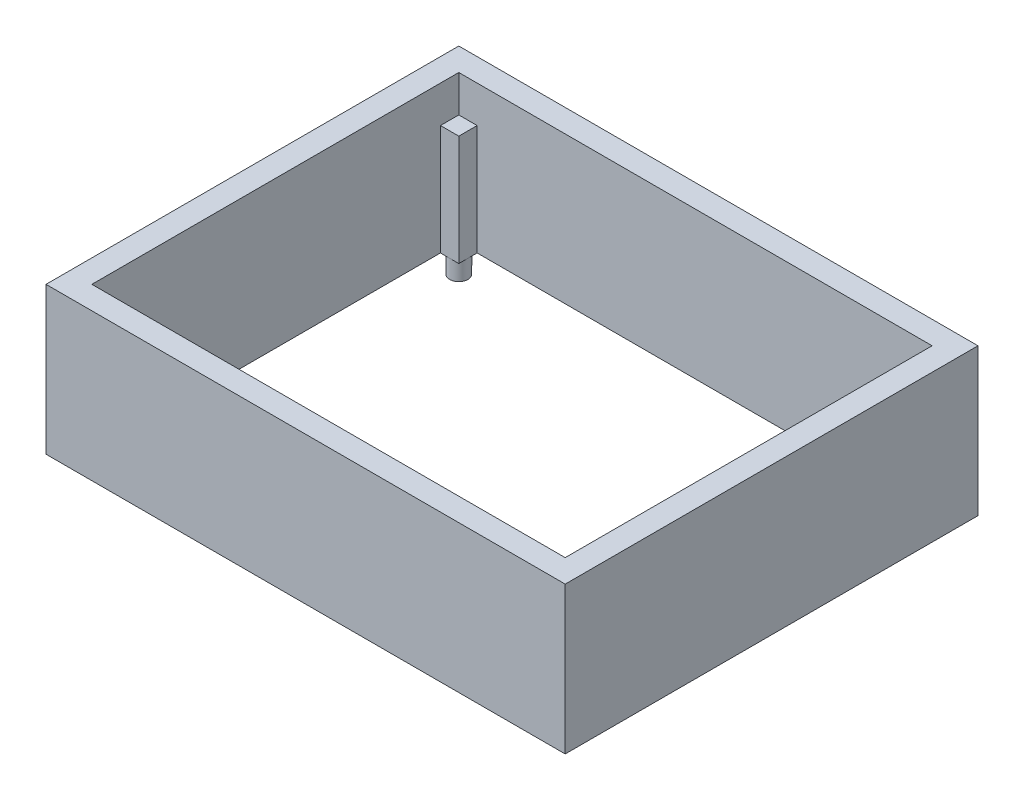
ISO-10303-21;
HEADER;
FILE_DESCRIPTION(('STEP AP214'),'2;1');
FILE_NAME('part.step','',(''),(''),'','','');
FILE_SCHEMA(('AUTOMOTIVE_DESIGN { 1 0 10303 214 1 1 1 1 }'));
ENDSEC;
DATA;
#1=APPLICATION_CONTEXT('core data for automotive mechanical design processes');
#2=APPLICATION_PROTOCOL_DEFINITION('international standard','automotive_design',2000,#1);
#3=PRODUCT_CONTEXT('',#1,'mechanical');
#4=PRODUCT('Part','Part','',(#3));
#5=PRODUCT_RELATED_PRODUCT_CATEGORY('part','',(#4));
#6=PRODUCT_DEFINITION_FORMATION('','',#4);
#7=PRODUCT_DEFINITION_CONTEXT('part definition',#1,'design');
#8=PRODUCT_DEFINITION('design','',#6,#7);
#9=PRODUCT_DEFINITION_SHAPE('','',#8);
#10=(LENGTH_UNIT() NAMED_UNIT(*) SI_UNIT(.MILLI.,.METRE.));
#11=(NAMED_UNIT(*) PLANE_ANGLE_UNIT() SI_UNIT($,.RADIAN.));
#12=(NAMED_UNIT(*) SI_UNIT($,.STERADIAN.) SOLID_ANGLE_UNIT());
#13=UNCERTAINTY_MEASURE_WITH_UNIT(LENGTH_MEASURE(1.E-05),#10,'distance_accuracy_value','');
#14=(GEOMETRIC_REPRESENTATION_CONTEXT(3) GLOBAL_UNCERTAINTY_ASSIGNED_CONTEXT((#13)) GLOBAL_UNIT_ASSIGNED_CONTEXT((#10,
#11,#12)) REPRESENTATION_CONTEXT('',''));
#15=CARTESIAN_POINT('',(0.,0.,0.));
#16=DIRECTION('',(0.,0.,1.));
#17=DIRECTION('',(1.,0.,0.));
#18=AXIS2_PLACEMENT_3D('',#15,#16,#17);
#19=CARTESIAN_POINT('',(0.,0.,0.));
#20=DIRECTION('',(0.,-1.,0.));
#21=DIRECTION('',(0.,0.,-1.));
#22=AXIS2_PLACEMENT_3D('',#19,#20,#21);
#23=PLANE('',#22);
#24=DIRECTION('',(-1.,0.,0.));
#25=VECTOR('',#24,1.);
#26=CARTESIAN_POINT('',(12.5,0.,-202.5));
#27=LINE('',#26,#25);
#28=CARTESIAN_POINT('',(22.5,0.,-202.5));
#29=VERTEX_POINT('',#28);
#30=CARTESIAN_POINT('',(17.5,0.,-202.5));
#31=VERTEX_POINT('',#30);
#32=EDGE_CURVE('E205',#29,#31,#27,.T.);
#33=ORIENTED_EDGE('',*,*,#32,.T.);
#34=CARTESIAN_POINT('',(17.5,0.,-207.5));
#35=DIRECTION('',(0.,-1.,0.));
#36=DIRECTION('',(0.,0.,-1.));
#37=AXIS2_PLACEMENT_3D('',#34,#35,#36);
#38=CIRCLE('',#37,5.);
#39=CARTESIAN_POINT('',(22.5,0.,-207.5));
#40=VERTEX_POINT('',#39);
#41=EDGE_CURVE('E49',#40,#31,#38,.T.);
#42=ORIENTED_EDGE('',*,*,#41,.F.);
#43=DIRECTION('',(0.,0.,1.));
#44=VECTOR('',#43,1.);
#45=CARTESIAN_POINT('',(22.5,0.,-212.5));
#46=LINE('',#45,#44);
#47=EDGE_CURVE('E202',#40,#29,#46,.T.);
#48=ORIENTED_EDGE('',*,*,#47,.T.);
#49=EDGE_LOOP('',(#33,#42,#48));
#50=FACE_BOUND('',#49,.T.);
#51=ADVANCED_FACE('F32',(#50),#23,.T.);
#52=DIRECTION('',(0.,0.,-1.));
#53=VECTOR('',#52,1.);
#54=CARTESIAN_POINT('',(260.5,0.,-212.5));
#55=LINE('',#54,#53);
#56=CARTESIAN_POINT('',(260.5,0.,-202.5));
#57=VERTEX_POINT('',#56);
#58=CARTESIAN_POINT('',(260.5,0.,-207.5));
#59=VERTEX_POINT('',#58);
#60=EDGE_CURVE('E694',#57,#59,#55,.T.);
#61=ORIENTED_EDGE('',*,*,#60,.T.);
#62=CARTESIAN_POINT('',(265.5,0.,-207.5));
#63=DIRECTION('',(0.,-1.,0.));
#64=DIRECTION('',(0.,0.,-1.));
#65=AXIS2_PLACEMENT_3D('',#62,#63,#64);
#66=CIRCLE('',#65,4.99999999999999);
#67=CARTESIAN_POINT('',(265.5,0.,-202.5));
#68=VERTEX_POINT('',#67);
#69=EDGE_CURVE('E56',#68,#59,#66,.T.);
#70=ORIENTED_EDGE('',*,*,#69,.F.);
#71=DIRECTION('',(-1.,0.,0.));
#72=VECTOR('',#71,1.);
#73=CARTESIAN_POINT('',(270.5,0.,-202.5));
#74=LINE('',#73,#72);
#75=EDGE_CURVE('E684',#68,#57,#74,.T.);
#76=ORIENTED_EDGE('',*,*,#75,.T.);
#77=EDGE_LOOP('',(#61,#70,#76));
#78=FACE_BOUND('',#77,.T.);
#79=ADVANCED_FACE('F346',(#78),#23,.T.);
#80=DIRECTION('',(1.,0.,0.));
#81=VECTOR('',#80,1.);
#82=CARTESIAN_POINT('',(270.5,0.,-22.5));
#83=LINE('',#82,#81);
#84=CARTESIAN_POINT('',(260.5,0.,-22.5));
#85=VERTEX_POINT('',#84);
#86=CARTESIAN_POINT('',(265.5,0.,-22.5));
#87=VERTEX_POINT('',#86);
#88=EDGE_CURVE('E665',#85,#87,#83,.T.);
#89=ORIENTED_EDGE('',*,*,#88,.T.);
#90=CARTESIAN_POINT('',(265.5,0.,-17.5));
#91=DIRECTION('',(0.,-1.,0.));
#92=DIRECTION('',(0.,0.,-1.));
#93=AXIS2_PLACEMENT_3D('',#90,#91,#92);
#94=CIRCLE('',#93,4.99999999999999);
#95=CARTESIAN_POINT('',(260.5,0.,-17.5));
#96=VERTEX_POINT('',#95);
#97=EDGE_CURVE('E649',#96,#87,#94,.T.);
#98=ORIENTED_EDGE('',*,*,#97,.F.);
#99=DIRECTION('',(0.,0.,-1.));
#100=VECTOR('',#99,1.);
#101=CARTESIAN_POINT('',(260.5,0.,-12.5));
#102=LINE('',#101,#100);
#103=EDGE_CURVE('E658',#96,#85,#102,.T.);
#104=ORIENTED_EDGE('',*,*,#103,.T.);
#105=EDGE_LOOP('',(#89,#98,#104));
#106=FACE_BOUND('',#105,.T.);
#107=ADVANCED_FACE('F351',(#106),#23,.T.);
#108=CARTESIAN_POINT('',(17.5,0.,-17.5));
#109=DIRECTION('',(0.,-1.,0.));
#110=DIRECTION('',(0.,0.,-1.));
#111=AXIS2_PLACEMENT_3D('',#108,#109,#110);
#112=CIRCLE('',#111,5.);
#113=CARTESIAN_POINT('',(17.5,0.,-22.5));
#114=VERTEX_POINT('',#113);
#115=CARTESIAN_POINT('',(22.5,0.,-17.5));
#116=VERTEX_POINT('',#115);
#117=EDGE_CURVE('E43',#114,#116,#112,.T.);
#118=ORIENTED_EDGE('',*,*,#117,.F.);
#119=DIRECTION('',(1.,0.,0.));
#120=VECTOR('',#119,1.);
#121=CARTESIAN_POINT('',(12.5,0.,-22.5));
#122=LINE('',#121,#120);
#123=CARTESIAN_POINT('',(22.5,0.,-22.5));
#124=VERTEX_POINT('',#123);
#125=EDGE_CURVE('E230',#114,#124,#122,.T.);
#126=ORIENTED_EDGE('',*,*,#125,.T.);
#127=DIRECTION('',(0.,0.,1.));
#128=VECTOR('',#127,1.);
#129=CARTESIAN_POINT('',(22.5,0.,-12.5));
#130=LINE('',#129,#128);
#131=EDGE_CURVE('E238',#124,#116,#130,.T.);
#132=ORIENTED_EDGE('',*,*,#131,.T.);
#133=EDGE_LOOP('',(#118,#126,#132));
#134=FACE_BOUND('',#133,.T.);
#135=ADVANCED_FACE('F342',(#134),#23,.T.);
#136=CARTESIAN_POINT('',(0.,80.2,0.));
#137=DIRECTION('',(-1.,0.,0.));
#138=DIRECTION('',(0.,0.,1.));
#139=AXIS2_PLACEMENT_3D('',#136,#137,#138);
#140=PLANE('',#139);
#141=DIRECTION('',(0.,0.,-1.));
#142=VECTOR('',#141,1.);
#143=CARTESIAN_POINT('',(0.,0.,0.));
#144=LINE('',#143,#142);
#145=CARTESIAN_POINT('',(0.,0.,0.));
#146=VERTEX_POINT('',#145);
#147=CARTESIAN_POINT('',(0.,0.,-225.));
#148=VERTEX_POINT('',#147);
#149=EDGE_CURVE('E288',#146,#148,#144,.T.);
#150=ORIENTED_EDGE('',*,*,#149,.F.);
#151=DIRECTION('',(0.,-1.,0.));
#152=VECTOR('',#151,1.);
#153=CARTESIAN_POINT('',(0.,80.2,0.));
#154=LINE('',#153,#152);
#155=CARTESIAN_POINT('',(0.,80.2,0.));
#156=VERTEX_POINT('',#155);
#157=EDGE_CURVE('E41',#156,#146,#154,.T.);
#158=ORIENTED_EDGE('',*,*,#157,.F.);
#159=DIRECTION('',(0.,0.,-1.));
#160=VECTOR('',#159,1.);
#161=CARTESIAN_POINT('',(0.,80.2,0.));
#162=LINE('',#161,#160);
#163=CARTESIAN_POINT('',(0.,80.2,-225.));
#164=VERTEX_POINT('',#163);
#165=EDGE_CURVE('E289',#156,#164,#162,.T.);
#166=ORIENTED_EDGE('',*,*,#165,.T.);
#167=DIRECTION('',(0.,-1.,0.));
#168=VECTOR('',#167,1.);
#169=CARTESIAN_POINT('',(0.,80.2,-225.));
#170=LINE('',#169,#168);
#171=EDGE_CURVE('E36',#164,#148,#170,.T.);
#172=ORIENTED_EDGE('',*,*,#171,.T.);
#173=EDGE_LOOP('',(#150,#158,#166,#172));
#174=FACE_BOUND('',#173,.T.);
#175=ADVANCED_FACE('F34',(#174),#140,.T.);
#176=CARTESIAN_POINT('',(0.,80.2,0.));
#177=DIRECTION('',(0.,0.,-1.));
#178=DIRECTION('',(-1.,0.,0.));
#179=AXIS2_PLACEMENT_3D('',#176,#177,#178);
#180=PLANE('',#179);
#181=DIRECTION('',(1.,0.,0.));
#182=VECTOR('',#181,1.);
#183=CARTESIAN_POINT('',(0.,0.,0.));
#184=LINE('',#183,#182);
#185=CARTESIAN_POINT('',(283.,0.,0.));
#186=VERTEX_POINT('',#185);
#187=EDGE_CURVE('E293',#146,#186,#184,.T.);
#188=ORIENTED_EDGE('',*,*,#187,.T.);
#189=DIRECTION('',(0.,-1.,0.));
#190=VECTOR('',#189,1.);
#191=CARTESIAN_POINT('',(283.,80.2,0.));
#192=LINE('',#191,#190);
#193=CARTESIAN_POINT('',(283.,80.2,0.));
#194=VERTEX_POINT('',#193);
#195=EDGE_CURVE('E310',#194,#186,#192,.T.);
#196=ORIENTED_EDGE('',*,*,#195,.F.);
#197=DIRECTION('',(1.,0.,0.));
#198=VECTOR('',#197,1.);
#199=CARTESIAN_POINT('',(0.,80.2,0.));
#200=LINE('',#199,#198);
#201=EDGE_CURVE('E298',#156,#194,#200,.T.);
#202=ORIENTED_EDGE('',*,*,#201,.F.);
#203=ORIENTED_EDGE('',*,*,#157,.T.);
#204=EDGE_LOOP('',(#188,#196,#202,#203));
#205=FACE_BOUND('',#204,.T.);
#206=ADVANCED_FACE('F325',(#205),#180,.F.);
#207=CARTESIAN_POINT('',(283.,80.2,0.));
#208=DIRECTION('',(-1.,0.,0.));
#209=DIRECTION('',(0.,0.,1.));
#210=AXIS2_PLACEMENT_3D('',#207,#208,#209);
#211=PLANE('',#210);
#212=DIRECTION('',(0.,0.,-1.));
#213=VECTOR('',#212,1.);
#214=CARTESIAN_POINT('',(283.,0.,0.));
#215=LINE('',#214,#213);
#216=CARTESIAN_POINT('',(283.,0.,-225.));
#217=VERTEX_POINT('',#216);
#218=EDGE_CURVE('E305',#186,#217,#215,.T.);
#219=ORIENTED_EDGE('',*,*,#218,.T.);
#220=DIRECTION('',(0.,-1.,0.));
#221=VECTOR('',#220,1.);
#222=CARTESIAN_POINT('',(283.,80.2,-225.));
#223=LINE('',#222,#221);
#224=CARTESIAN_POINT('',(283.,80.2,-225.));
#225=VERTEX_POINT('',#224);
#226=EDGE_CURVE('E312',#225,#217,#223,.T.);
#227=ORIENTED_EDGE('',*,*,#226,.F.);
#228=DIRECTION('',(0.,0.,-1.));
#229=VECTOR('',#228,1.);
#230=CARTESIAN_POINT('',(283.,80.2,0.));
#231=LINE('',#230,#229);
#232=EDGE_CURVE('E296',#194,#225,#231,.T.);
#233=ORIENTED_EDGE('',*,*,#232,.F.);
#234=ORIENTED_EDGE('',*,*,#195,.T.);
#235=EDGE_LOOP('',(#219,#227,#233,#234));
#236=FACE_BOUND('',#235,.T.);
#237=ADVANCED_FACE('F329',(#236),#211,.F.);
#238=CARTESIAN_POINT('',(0.,80.2,-225.));
#239=DIRECTION('',(0.,0.,-1.));
#240=DIRECTION('',(-1.,0.,0.));
#241=AXIS2_PLACEMENT_3D('',#238,#239,#240);
#242=PLANE('',#241);
#243=DIRECTION('',(1.,0.,0.));
#244=VECTOR('',#243,1.);
#245=CARTESIAN_POINT('',(0.,0.,-225.));
#246=LINE('',#245,#244);
#247=EDGE_CURVE('E302',#148,#217,#246,.T.);
#248=ORIENTED_EDGE('',*,*,#247,.F.);
#249=ORIENTED_EDGE('',*,*,#171,.F.);
#250=DIRECTION('',(1.,0.,0.));
#251=VECTOR('',#250,1.);
#252=CARTESIAN_POINT('',(0.,80.2,-225.));
#253=LINE('',#252,#251);
#254=EDGE_CURVE('E292',#164,#225,#253,.T.);
#255=ORIENTED_EDGE('',*,*,#254,.T.);
#256=ORIENTED_EDGE('',*,*,#226,.T.);
#257=EDGE_LOOP('',(#248,#249,#255,#256));
#258=FACE_BOUND('',#257,.T.);
#259=ADVANCED_FACE('F320',(#258),#242,.T.);
#260=CARTESIAN_POINT('',(0.,80.2,0.));
#261=DIRECTION('',(0.,-1.,0.));
#262=DIRECTION('',(0.,0.,-1.));
#263=AXIS2_PLACEMENT_3D('',#260,#261,#262);
#264=PLANE('',#263);
#265=DIRECTION('',(1.,0.,0.));
#266=VECTOR('',#265,1.);
#267=CARTESIAN_POINT('',(12.5,80.2,-12.5));
#268=LINE('',#267,#266);
#269=CARTESIAN_POINT('',(12.5,80.2,-12.5));
#270=VERTEX_POINT('',#269);
#271=CARTESIAN_POINT('',(270.5,80.2,-12.5));
#272=VERTEX_POINT('',#271);
#273=EDGE_CURVE('E265',#270,#272,#268,.T.);
#274=ORIENTED_EDGE('',*,*,#273,.F.);
#275=DIRECTION('',(0.,0.,1.));
#276=VECTOR('',#275,1.);
#277=CARTESIAN_POINT('',(12.5,80.2,-212.5));
#278=LINE('',#277,#276);
#279=CARTESIAN_POINT('',(12.5,80.2,-212.5));
#280=VERTEX_POINT('',#279);
#281=EDGE_CURVE('E268',#280,#270,#278,.T.);
#282=ORIENTED_EDGE('',*,*,#281,.F.);
#283=DIRECTION('',(-1.,0.,0.));
#284=VECTOR('',#283,1.);
#285=CARTESIAN_POINT('',(270.5,80.2,-212.5));
#286=LINE('',#285,#284);
#287=CARTESIAN_POINT('',(270.5,80.2,-212.5));
#288=VERTEX_POINT('',#287);
#289=EDGE_CURVE('E255',#288,#280,#286,.T.);
#290=ORIENTED_EDGE('',*,*,#289,.F.);
#291=DIRECTION('',(0.,0.,-1.));
#292=VECTOR('',#291,1.);
#293=CARTESIAN_POINT('',(270.5,80.2,-12.5));
#294=LINE('',#293,#292);
#295=EDGE_CURVE('E261',#272,#288,#294,.T.);
#296=ORIENTED_EDGE('',*,*,#295,.F.);
#297=EDGE_LOOP('',(#274,#282,#290,#296));
#298=FACE_BOUND('',#297,.T.);
#299=ORIENTED_EDGE('',*,*,#165,.F.);
#300=ORIENTED_EDGE('',*,*,#201,.T.);
#301=ORIENTED_EDGE('',*,*,#232,.T.);
#302=ORIENTED_EDGE('',*,*,#254,.F.);
#303=EDGE_LOOP('',(#299,#300,#301,#302));
#304=FACE_BOUND('',#303,.T.);
#305=ADVANCED_FACE('F331',(#298,#304),#264,.F.);
#306=CARTESIAN_POINT('',(22.5,0.,-212.5));
#307=VERTEX_POINT('',#306);
#308=EDGE_CURVE('E210',#307,#40,#46,.T.);
#309=ORIENTED_EDGE('',*,*,#308,.T.);
#310=EDGE_CURVE('E193',#31,#40,#38,.T.);
#311=ORIENTED_EDGE('',*,*,#310,.F.);
#312=CARTESIAN_POINT('',(12.5,0.,-202.5));
#313=VERTEX_POINT('',#312);
#314=EDGE_CURVE('E220',#31,#313,#27,.T.);
#315=ORIENTED_EDGE('',*,*,#314,.T.);
#316=DIRECTION('',(0.,0.,1.));
#317=VECTOR('',#316,1.);
#318=CARTESIAN_POINT('',(12.5,0.,-212.5));
#319=LINE('',#318,#317);
#320=CARTESIAN_POINT('',(12.5,0.,-22.5));
#321=VERTEX_POINT('',#320);
#322=EDGE_CURVE('E264',#313,#321,#319,.T.);
#323=ORIENTED_EDGE('',*,*,#322,.T.);
#324=EDGE_CURVE('E247',#321,#114,#122,.T.);
#325=ORIENTED_EDGE('',*,*,#324,.T.);
#326=EDGE_CURVE('E11',#116,#114,#112,.T.);
#327=ORIENTED_EDGE('',*,*,#326,.F.);
#328=CARTESIAN_POINT('',(22.5,0.,-12.5));
#329=VERTEX_POINT('',#328);
#330=EDGE_CURVE('E249',#116,#329,#130,.T.);
#331=ORIENTED_EDGE('',*,*,#330,.T.);
#332=DIRECTION('',(1.,0.,0.));
#333=VECTOR('',#332,1.);
#334=CARTESIAN_POINT('',(12.5,0.,-12.5));
#335=LINE('',#334,#333);
#336=CARTESIAN_POINT('',(260.5,0.,-12.5));
#337=VERTEX_POINT('',#336);
#338=EDGE_CURVE('E281',#329,#337,#335,.T.);
#339=ORIENTED_EDGE('',*,*,#338,.T.);
#340=EDGE_CURVE('E675',#337,#96,#102,.T.);
#341=ORIENTED_EDGE('',*,*,#340,.T.);
#342=EDGE_CURVE('E654',#87,#96,#94,.T.);
#343=ORIENTED_EDGE('',*,*,#342,.F.);
#344=CARTESIAN_POINT('',(270.5,0.,-22.5));
#345=VERTEX_POINT('',#344);
#346=EDGE_CURVE('E678',#87,#345,#83,.T.);
#347=ORIENTED_EDGE('',*,*,#346,.T.);
#348=DIRECTION('',(0.,0.,-1.));
#349=VECTOR('',#348,1.);
#350=CARTESIAN_POINT('',(270.5,0.,-12.5));
#351=LINE('',#350,#349);
#352=CARTESIAN_POINT('',(270.5,0.,-202.5));
#353=VERTEX_POINT('',#352);
#354=EDGE_CURVE('E278',#345,#353,#351,.T.);
#355=ORIENTED_EDGE('',*,*,#354,.T.);
#356=EDGE_CURVE('E703',#353,#68,#74,.T.);
#357=ORIENTED_EDGE('',*,*,#356,.T.);
#358=EDGE_CURVE('E643',#59,#68,#66,.T.);
#359=ORIENTED_EDGE('',*,*,#358,.F.);
#360=CARTESIAN_POINT('',(260.5,0.,-212.5));
#361=VERTEX_POINT('',#360);
#362=EDGE_CURVE('E706',#59,#361,#55,.T.);
#363=ORIENTED_EDGE('',*,*,#362,.T.);
#364=DIRECTION('',(-1.,0.,0.));
#365=VECTOR('',#364,1.);
#366=CARTESIAN_POINT('',(270.5,0.,-212.5));
#367=LINE('',#366,#365);
#368=EDGE_CURVE('E219',#361,#307,#367,.T.);
#369=ORIENTED_EDGE('',*,*,#368,.T.);
#370=EDGE_LOOP('',(#309,#311,#315,#323,#325,#327,#331,#339,#341,#343,#347,#355,#357,#359,#363,#369));
#371=FACE_BOUND('',#370,.T.);
#372=ORIENTED_EDGE('',*,*,#149,.T.);
#373=ORIENTED_EDGE('',*,*,#247,.T.);
#374=ORIENTED_EDGE('',*,*,#218,.F.);
#375=ORIENTED_EDGE('',*,*,#187,.F.);
#376=EDGE_LOOP('',(#372,#373,#374,#375));
#377=FACE_BOUND('',#376,.T.);
#378=ADVANCED_FACE('F216',(#371,#377),#23,.T.);
#379=CARTESIAN_POINT('',(12.5,-326.441418940673,-212.5));
#380=DIRECTION('',(-1.,0.,0.));
#381=DIRECTION('',(0.,0.,1.));
#382=AXIS2_PLACEMENT_3D('',#379,#380,#381);
#383=PLANE('',#382);
#384=ORIENTED_EDGE('',*,*,#322,.F.);
#385=DIRECTION('',(0.,-1.,0.));
#386=VECTOR('',#385,1.);
#387=CARTESIAN_POINT('',(12.5,60.16,-202.5));
#388=LINE('',#387,#386);
#389=CARTESIAN_POINT('',(12.5,60.16,-202.5));
#390=VERTEX_POINT('',#389);
#391=EDGE_CURVE('E227',#390,#313,#388,.T.);
#392=ORIENTED_EDGE('',*,*,#391,.F.);
#393=DIRECTION('',(0.,0.,-1.));
#394=VECTOR('',#393,1.);
#395=CARTESIAN_POINT('',(12.5,60.16,-212.5));
#396=LINE('',#395,#394);
#397=CARTESIAN_POINT('',(12.5,60.16,-212.5));
#398=VERTEX_POINT('',#397);
#399=EDGE_CURVE('E226',#390,#398,#396,.T.);
#400=ORIENTED_EDGE('',*,*,#399,.T.);
#401=DIRECTION('',(0.,1.,0.));
#402=VECTOR('',#401,1.);
#403=CARTESIAN_POINT('',(12.5,-326.441418940673,-212.5));
#404=LINE('',#403,#402);
#405=EDGE_CURVE('E276',#398,#280,#404,.T.);
#406=ORIENTED_EDGE('',*,*,#405,.T.);
#407=ORIENTED_EDGE('',*,*,#281,.T.);
#408=DIRECTION('',(0.,1.,0.));
#409=VECTOR('',#408,1.);
#410=CARTESIAN_POINT('',(12.5,-326.441418940673,-12.5));
#411=LINE('',#410,#409);
#412=CARTESIAN_POINT('',(12.5,60.16,-12.5));
#413=VERTEX_POINT('',#412);
#414=EDGE_CURVE('E274',#413,#270,#411,.T.);
#415=ORIENTED_EDGE('',*,*,#414,.F.);
#416=DIRECTION('',(0.,0.,-1.));
#417=VECTOR('',#416,1.);
#418=CARTESIAN_POINT('',(12.5,60.16,-12.5));
#419=LINE('',#418,#417);
#420=CARTESIAN_POINT('',(12.5,60.16,-22.5));
#421=VERTEX_POINT('',#420);
#422=EDGE_CURVE('E234',#413,#421,#419,.T.);
#423=ORIENTED_EDGE('',*,*,#422,.T.);
#424=DIRECTION('',(0.,-1.,0.));
#425=VECTOR('',#424,1.);
#426=CARTESIAN_POINT('',(12.5,60.16,-22.5));
#427=LINE('',#426,#425);
#428=EDGE_CURVE('E246',#421,#321,#427,.T.);
#429=ORIENTED_EDGE('',*,*,#428,.T.);
#430=EDGE_LOOP('',(#384,#392,#400,#406,#407,#415,#423,#429));
#431=FACE_BOUND('',#430,.T.);
#432=ADVANCED_FACE('F340',(#431),#383,.F.);
#433=CARTESIAN_POINT('',(12.5,-326.441418940673,-12.5));
#434=DIRECTION('',(0.,0.,1.));
#435=DIRECTION('',(1.,0.,0.));
#436=AXIS2_PLACEMENT_3D('',#433,#434,#435);
#437=PLANE('',#436);
#438=DIRECTION('',(-1.,0.,0.));
#439=VECTOR('',#438,1.);
#440=CARTESIAN_POINT('',(270.5,60.16,-12.5));
#441=LINE('',#440,#439);
#442=CARTESIAN_POINT('',(270.5,60.16,-12.5));
#443=VERTEX_POINT('',#442);
#444=CARTESIAN_POINT('',(260.5,60.16,-12.5));
#445=VERTEX_POINT('',#444);
#446=EDGE_CURVE('E664',#443,#445,#441,.T.);
#447=ORIENTED_EDGE('',*,*,#446,.T.);
#448=DIRECTION('',(0.,-1.,0.));
#449=VECTOR('',#448,1.);
#450=CARTESIAN_POINT('',(260.5,60.16,-12.5));
#451=LINE('',#450,#449);
#452=EDGE_CURVE('E674',#445,#337,#451,.T.);
#453=ORIENTED_EDGE('',*,*,#452,.T.);
#454=ORIENTED_EDGE('',*,*,#338,.F.);
#455=DIRECTION('',(0.,-1.,0.));
#456=VECTOR('',#455,1.);
#457=CARTESIAN_POINT('',(22.5,60.16,-12.5));
#458=LINE('',#457,#456);
#459=CARTESIAN_POINT('',(22.5,60.16,-12.5));
#460=VERTEX_POINT('',#459);
#461=EDGE_CURVE('E252',#460,#329,#458,.T.);
#462=ORIENTED_EDGE('',*,*,#461,.F.);
#463=DIRECTION('',(-1.,0.,0.));
#464=VECTOR('',#463,1.);
#465=CARTESIAN_POINT('',(12.5,60.16,-12.5));
#466=LINE('',#465,#464);
#467=EDGE_CURVE('E243',#460,#413,#466,.T.);
#468=ORIENTED_EDGE('',*,*,#467,.T.);
#469=ORIENTED_EDGE('',*,*,#414,.T.);
#470=ORIENTED_EDGE('',*,*,#273,.T.);
#471=DIRECTION('',(0.,1.,0.));
#472=VECTOR('',#471,1.);
#473=CARTESIAN_POINT('',(270.5,-326.441418940673,-12.5));
#474=LINE('',#473,#472);
#475=EDGE_CURVE('E280',#443,#272,#474,.T.);
#476=ORIENTED_EDGE('',*,*,#475,.F.);
#477=EDGE_LOOP('',(#447,#453,#454,#462,#468,#469,#470,#476));
#478=FACE_BOUND('',#477,.T.);
#479=ADVANCED_FACE('F378',(#478),#437,.F.);
#480=CARTESIAN_POINT('',(270.5,-326.441418940673,-12.5));
#481=DIRECTION('',(1.,0.,0.));
#482=DIRECTION('',(0.,0.,-1.));
#483=AXIS2_PLACEMENT_3D('',#480,#481,#482);
#484=PLANE('',#483);
#485=ORIENTED_EDGE('',*,*,#354,.F.);
#486=DIRECTION('',(0.,-1.,0.));
#487=VECTOR('',#486,1.);
#488=CARTESIAN_POINT('',(270.5,60.16,-22.5));
#489=LINE('',#488,#487);
#490=CARTESIAN_POINT('',(270.5,60.16,-22.5));
#491=VERTEX_POINT('',#490);
#492=EDGE_CURVE('E681',#491,#345,#489,.T.);
#493=ORIENTED_EDGE('',*,*,#492,.F.);
#494=DIRECTION('',(0.,0.,1.));
#495=VECTOR('',#494,1.);
#496=CARTESIAN_POINT('',(270.5,60.16,-12.5));
#497=LINE('',#496,#495);
#498=EDGE_CURVE('E661',#491,#443,#497,.T.);
#499=ORIENTED_EDGE('',*,*,#498,.T.);
#500=ORIENTED_EDGE('',*,*,#475,.T.);
#501=ORIENTED_EDGE('',*,*,#295,.T.);
#502=DIRECTION('',(0.,1.,0.));
#503=VECTOR('',#502,1.);
#504=CARTESIAN_POINT('',(270.5,-326.441418940673,-212.5));
#505=LINE('',#504,#503);
#506=CARTESIAN_POINT('',(270.5,60.16,-212.5));
#507=VERTEX_POINT('',#506);
#508=EDGE_CURVE('E277',#507,#288,#505,.T.);
#509=ORIENTED_EDGE('',*,*,#508,.F.);
#510=DIRECTION('',(0.,0.,1.));
#511=VECTOR('',#510,1.);
#512=CARTESIAN_POINT('',(270.5,60.16,-212.5));
#513=LINE('',#512,#511);
#514=CARTESIAN_POINT('',(270.5,60.16,-202.5));
#515=VERTEX_POINT('',#514);
#516=EDGE_CURVE('E690',#507,#515,#513,.T.);
#517=ORIENTED_EDGE('',*,*,#516,.T.);
#518=DIRECTION('',(0.,-1.,0.));
#519=VECTOR('',#518,1.);
#520=CARTESIAN_POINT('',(270.5,60.16,-202.5));
#521=LINE('',#520,#519);
#522=EDGE_CURVE('E702',#515,#353,#521,.T.);
#523=ORIENTED_EDGE('',*,*,#522,.T.);
#524=EDGE_LOOP('',(#485,#493,#499,#500,#501,#509,#517,#523));
#525=FACE_BOUND('',#524,.T.);
#526=ADVANCED_FACE('F385',(#525),#484,.F.);
#527=CARTESIAN_POINT('',(270.5,-326.441418940673,-212.5));
#528=DIRECTION('',(0.,0.,-1.));
#529=DIRECTION('',(-1.,0.,0.));
#530=AXIS2_PLACEMENT_3D('',#527,#528,#529);
#531=PLANE('',#530);
#532=ORIENTED_EDGE('',*,*,#368,.F.);
#533=DIRECTION('',(0.,-1.,0.));
#534=VECTOR('',#533,1.);
#535=CARTESIAN_POINT('',(260.5,60.16,-212.5));
#536=LINE('',#535,#534);
#537=CARTESIAN_POINT('',(260.5,60.16,-212.5));
#538=VERTEX_POINT('',#537);
#539=EDGE_CURVE('E214',#538,#361,#536,.T.);
#540=ORIENTED_EDGE('',*,*,#539,.F.);
#541=DIRECTION('',(1.,0.,0.));
#542=VECTOR('',#541,1.);
#543=CARTESIAN_POINT('',(270.5,60.16,-212.5));
#544=LINE('',#543,#542);
#545=EDGE_CURVE('E699',#538,#507,#544,.T.);
#546=ORIENTED_EDGE('',*,*,#545,.T.);
#547=ORIENTED_EDGE('',*,*,#508,.T.);
#548=ORIENTED_EDGE('',*,*,#289,.T.);
#549=ORIENTED_EDGE('',*,*,#405,.F.);
#550=DIRECTION('',(1.,0.,0.));
#551=VECTOR('',#550,1.);
#552=CARTESIAN_POINT('',(12.5,60.16,-212.5));
#553=LINE('',#552,#551);
#554=CARTESIAN_POINT('',(22.5,60.16,-212.5));
#555=VERTEX_POINT('',#554);
#556=EDGE_CURVE('E718',#398,#555,#553,.T.);
#557=ORIENTED_EDGE('',*,*,#556,.T.);
#558=DIRECTION('',(0.,-1.,0.));
#559=VECTOR('',#558,1.);
#560=CARTESIAN_POINT('',(22.5,60.16,-212.5));
#561=LINE('',#560,#559);
#562=EDGE_CURVE('E232',#555,#307,#561,.T.);
#563=ORIENTED_EDGE('',*,*,#562,.T.);
#564=EDGE_LOOP('',(#532,#540,#546,#547,#548,#549,#557,#563));
#565=FACE_BOUND('',#564,.T.);
#566=ADVANCED_FACE('F393',(#565),#531,.F.);
#567=CARTESIAN_POINT('',(22.5,60.16,-12.5));
#568=DIRECTION('',(1.,0.,0.));
#569=DIRECTION('',(0.,0.,-1.));
#570=AXIS2_PLACEMENT_3D('',#567,#568,#569);
#571=PLANE('',#570);
#572=ORIENTED_EDGE('',*,*,#131,.F.);
#573=DIRECTION('',(0.,-1.,0.));
#574=VECTOR('',#573,1.);
#575=CARTESIAN_POINT('',(22.5,60.16,-22.5));
#576=LINE('',#575,#574);
#577=CARTESIAN_POINT('',(22.5,60.16,-22.5));
#578=VERTEX_POINT('',#577);
#579=EDGE_CURVE('E256',#578,#124,#576,.T.);
#580=ORIENTED_EDGE('',*,*,#579,.F.);
#581=DIRECTION('',(0.,0.,1.));
#582=VECTOR('',#581,1.);
#583=CARTESIAN_POINT('',(22.5,60.16,-12.5));
#584=LINE('',#583,#582);
#585=EDGE_CURVE('E241',#578,#460,#584,.T.);
#586=ORIENTED_EDGE('',*,*,#585,.T.);
#587=ORIENTED_EDGE('',*,*,#461,.T.);
#588=ORIENTED_EDGE('',*,*,#330,.F.);
#589=EDGE_LOOP('',(#572,#580,#586,#587,#588));
#590=FACE_BOUND('',#589,.T.);
#591=ADVANCED_FACE('F400',(#590),#571,.T.);
#592=CARTESIAN_POINT('',(12.5,60.16,-22.5));
#593=DIRECTION('',(0.,0.,-1.));
#594=DIRECTION('',(-1.,0.,0.));
#595=AXIS2_PLACEMENT_3D('',#592,#593,#594);
#596=PLANE('',#595);
#597=ORIENTED_EDGE('',*,*,#324,.F.);
#598=ORIENTED_EDGE('',*,*,#428,.F.);
#599=DIRECTION('',(1.,0.,0.));
#600=VECTOR('',#599,1.);
#601=CARTESIAN_POINT('',(12.5,60.16,-22.5));
#602=LINE('',#601,#600);
#603=EDGE_CURVE('E237',#421,#578,#602,.T.);
#604=ORIENTED_EDGE('',*,*,#603,.T.);
#605=ORIENTED_EDGE('',*,*,#579,.T.);
#606=ORIENTED_EDGE('',*,*,#125,.F.);
#607=EDGE_LOOP('',(#597,#598,#604,#605,#606));
#608=FACE_BOUND('',#607,.T.);
#609=ADVANCED_FACE('F411',(#608),#596,.T.);
#610=CARTESIAN_POINT('',(0.,60.16,0.));
#611=DIRECTION('',(0.,-1.,0.));
#612=DIRECTION('',(0.,0.,-1.));
#613=AXIS2_PLACEMENT_3D('',#610,#611,#612);
#614=PLANE('',#613);
#615=ORIENTED_EDGE('',*,*,#422,.F.);
#616=ORIENTED_EDGE('',*,*,#467,.F.);
#617=ORIENTED_EDGE('',*,*,#585,.F.);
#618=ORIENTED_EDGE('',*,*,#603,.F.);
#619=EDGE_LOOP('',(#615,#616,#617,#618));
#620=FACE_BOUND('',#619,.T.);
#621=ADVANCED_FACE('F405',(#620),#614,.F.);
#622=CARTESIAN_POINT('',(12.5,60.16,-202.5));
#623=DIRECTION('',(0.,0.,1.));
#624=DIRECTION('',(1.,0.,0.));
#625=AXIS2_PLACEMENT_3D('',#622,#623,#624);
#626=PLANE('',#625);
#627=ORIENTED_EDGE('',*,*,#32,.F.);
#628=DIRECTION('',(0.,-1.,0.));
#629=VECTOR('',#628,1.);
#630=CARTESIAN_POINT('',(22.5,60.16,-202.5));
#631=LINE('',#630,#629);
#632=CARTESIAN_POINT('',(22.5,60.16,-202.5));
#633=VERTEX_POINT('',#632);
#634=EDGE_CURVE('E213',#633,#29,#631,.T.);
#635=ORIENTED_EDGE('',*,*,#634,.F.);
#636=DIRECTION('',(-1.,0.,0.));
#637=VECTOR('',#636,1.);
#638=CARTESIAN_POINT('',(12.5,60.16,-202.5));
#639=LINE('',#638,#637);
#640=EDGE_CURVE('E223',#633,#390,#639,.T.);
#641=ORIENTED_EDGE('',*,*,#640,.T.);
#642=ORIENTED_EDGE('',*,*,#391,.T.);
#643=ORIENTED_EDGE('',*,*,#314,.F.);
#644=EDGE_LOOP('',(#627,#635,#641,#642,#643));
#645=FACE_BOUND('',#644,.T.);
#646=ADVANCED_FACE('F410',(#645),#626,.T.);
#647=CARTESIAN_POINT('',(22.5,60.16,-212.5));
#648=DIRECTION('',(1.,0.,0.));
#649=DIRECTION('',(0.,0.,-1.));
#650=AXIS2_PLACEMENT_3D('',#647,#648,#649);
#651=PLANE('',#650);
#652=ORIENTED_EDGE('',*,*,#308,.F.);
#653=ORIENTED_EDGE('',*,*,#562,.F.);
#654=DIRECTION('',(0.,0.,1.));
#655=VECTOR('',#654,1.);
#656=CARTESIAN_POINT('',(22.5,60.16,-212.5));
#657=LINE('',#656,#655);
#658=EDGE_CURVE('E720',#555,#633,#657,.T.);
#659=ORIENTED_EDGE('',*,*,#658,.T.);
#660=ORIENTED_EDGE('',*,*,#634,.T.);
#661=ORIENTED_EDGE('',*,*,#47,.F.);
#662=EDGE_LOOP('',(#652,#653,#659,#660,#661));
#663=FACE_BOUND('',#662,.T.);
#664=ADVANCED_FACE('F209',(#663),#651,.T.);
#665=CARTESIAN_POINT('',(0.,60.16,0.));
#666=DIRECTION('',(0.,1.,0.));
#667=DIRECTION('',(0.,0.,1.));
#668=AXIS2_PLACEMENT_3D('',#665,#666,#667);
#669=PLANE('',#668);
#670=ORIENTED_EDGE('',*,*,#399,.F.);
#671=ORIENTED_EDGE('',*,*,#640,.F.);
#672=ORIENTED_EDGE('',*,*,#658,.F.);
#673=ORIENTED_EDGE('',*,*,#556,.F.);
#674=EDGE_LOOP('',(#670,#671,#672,#673));
#675=FACE_BOUND('',#674,.T.);
#676=ADVANCED_FACE('F421',(#675),#669,.T.);
#677=CARTESIAN_POINT('',(260.5,60.16,-212.5));
#678=DIRECTION('',(-1.,0.,0.));
#679=DIRECTION('',(0.,0.,1.));
#680=AXIS2_PLACEMENT_3D('',#677,#678,#679);
#681=PLANE('',#680);
#682=ORIENTED_EDGE('',*,*,#60,.F.);
#683=DIRECTION('',(0.,-1.,0.));
#684=VECTOR('',#683,1.);
#685=CARTESIAN_POINT('',(260.5,60.16,-202.5));
#686=LINE('',#685,#684);
#687=CARTESIAN_POINT('',(260.5,60.16,-202.5));
#688=VERTEX_POINT('',#687);
#689=EDGE_CURVE('E711',#688,#57,#686,.T.);
#690=ORIENTED_EDGE('',*,*,#689,.F.);
#691=DIRECTION('',(0.,0.,-1.));
#692=VECTOR('',#691,1.);
#693=CARTESIAN_POINT('',(260.5,60.16,-212.5));
#694=LINE('',#693,#692);
#695=EDGE_CURVE('E697',#688,#538,#694,.T.);
#696=ORIENTED_EDGE('',*,*,#695,.T.);
#697=ORIENTED_EDGE('',*,*,#539,.T.);
#698=ORIENTED_EDGE('',*,*,#362,.F.);
#699=EDGE_LOOP('',(#682,#690,#696,#697,#698));
#700=FACE_BOUND('',#699,.T.);
#701=ADVANCED_FACE('F426',(#700),#681,.T.);
#702=CARTESIAN_POINT('',(270.5,60.16,-202.5));
#703=DIRECTION('',(0.,0.,1.));
#704=DIRECTION('',(1.,0.,0.));
#705=AXIS2_PLACEMENT_3D('',#702,#703,#704);
#706=PLANE('',#705);
#707=ORIENTED_EDGE('',*,*,#356,.F.);
#708=ORIENTED_EDGE('',*,*,#522,.F.);
#709=DIRECTION('',(-1.,0.,0.));
#710=VECTOR('',#709,1.);
#711=CARTESIAN_POINT('',(270.5,60.16,-202.5));
#712=LINE('',#711,#710);
#713=EDGE_CURVE('E693',#515,#688,#712,.T.);
#714=ORIENTED_EDGE('',*,*,#713,.T.);
#715=ORIENTED_EDGE('',*,*,#689,.T.);
#716=ORIENTED_EDGE('',*,*,#75,.F.);
#717=EDGE_LOOP('',(#707,#708,#714,#715,#716));
#718=FACE_BOUND('',#717,.T.);
#719=ADVANCED_FACE('F442',(#718),#706,.T.);
#720=CARTESIAN_POINT('',(0.,60.16,0.));
#721=DIRECTION('',(0.,-1.,0.));
#722=DIRECTION('',(0.,0.,-1.));
#723=AXIS2_PLACEMENT_3D('',#720,#721,#722);
#724=PLANE('',#723);
#725=ORIENTED_EDGE('',*,*,#516,.F.);
#726=ORIENTED_EDGE('',*,*,#545,.F.);
#727=ORIENTED_EDGE('',*,*,#695,.F.);
#728=ORIENTED_EDGE('',*,*,#713,.F.);
#729=EDGE_LOOP('',(#725,#726,#727,#728));
#730=FACE_BOUND('',#729,.T.);
#731=ADVANCED_FACE('F436',(#730),#724,.F.);
#732=CARTESIAN_POINT('',(270.5,60.16,-22.5));
#733=DIRECTION('',(0.,0.,-1.));
#734=DIRECTION('',(-1.,0.,0.));
#735=AXIS2_PLACEMENT_3D('',#732,#733,#734);
#736=PLANE('',#735);
#737=ORIENTED_EDGE('',*,*,#88,.F.);
#738=DIRECTION('',(0.,-1.,0.));
#739=VECTOR('',#738,1.);
#740=CARTESIAN_POINT('',(260.5,60.16,-22.5));
#741=LINE('',#740,#739);
#742=CARTESIAN_POINT('',(260.5,60.16,-22.5));
#743=VERTEX_POINT('',#742);
#744=EDGE_CURVE('E685',#743,#85,#741,.T.);
#745=ORIENTED_EDGE('',*,*,#744,.F.);
#746=DIRECTION('',(1.,0.,0.));
#747=VECTOR('',#746,1.);
#748=CARTESIAN_POINT('',(270.5,60.16,-22.5));
#749=LINE('',#748,#747);
#750=EDGE_CURVE('E671',#743,#491,#749,.T.);
#751=ORIENTED_EDGE('',*,*,#750,.T.);
#752=ORIENTED_EDGE('',*,*,#492,.T.);
#753=ORIENTED_EDGE('',*,*,#346,.F.);
#754=EDGE_LOOP('',(#737,#745,#751,#752,#753));
#755=FACE_BOUND('',#754,.T.);
#756=ADVANCED_FACE('F441',(#755),#736,.T.);
#757=CARTESIAN_POINT('',(260.5,60.16,-12.5));
#758=DIRECTION('',(-1.,0.,0.));
#759=DIRECTION('',(0.,0.,1.));
#760=AXIS2_PLACEMENT_3D('',#757,#758,#759);
#761=PLANE('',#760);
#762=ORIENTED_EDGE('',*,*,#340,.F.);
#763=ORIENTED_EDGE('',*,*,#452,.F.);
#764=DIRECTION('',(0.,0.,-1.));
#765=VECTOR('',#764,1.);
#766=CARTESIAN_POINT('',(260.5,60.16,-12.5));
#767=LINE('',#766,#765);
#768=EDGE_CURVE('E668',#445,#743,#767,.T.);
#769=ORIENTED_EDGE('',*,*,#768,.T.);
#770=ORIENTED_EDGE('',*,*,#744,.T.);
#771=ORIENTED_EDGE('',*,*,#103,.F.);
#772=EDGE_LOOP('',(#762,#763,#769,#770,#771));
#773=FACE_BOUND('',#772,.T.);
#774=ADVANCED_FACE('F457',(#773),#761,.T.);
#775=CARTESIAN_POINT('',(0.,60.16,0.));
#776=DIRECTION('',(0.,1.,0.));
#777=DIRECTION('',(0.,0.,1.));
#778=AXIS2_PLACEMENT_3D('',#775,#776,#777);
#779=PLANE('',#778);
#780=ORIENTED_EDGE('',*,*,#498,.F.);
#781=ORIENTED_EDGE('',*,*,#750,.F.);
#782=ORIENTED_EDGE('',*,*,#768,.F.);
#783=ORIENTED_EDGE('',*,*,#446,.F.);
#784=EDGE_LOOP('',(#780,#781,#782,#783));
#785=FACE_BOUND('',#784,.T.);
#786=ADVANCED_FACE('F452',(#785),#779,.T.);
#787=CARTESIAN_POINT('',(17.5,-10.,-17.5));
#788=DIRECTION('',(0.,1.,0.));
#789=DIRECTION('',(0.,0.,1.));
#790=AXIS2_PLACEMENT_3D('',#787,#788,#789);
#791=CYLINDRICAL_SURFACE('',#790,5.);
#792=CARTESIAN_POINT('',(17.5,-10.,-17.5));
#793=DIRECTION('',(0.,-1.,0.));
#794=DIRECTION('',(0.,0.,-1.));
#795=AXIS2_PLACEMENT_3D('',#792,#793,#794);
#796=CIRCLE('',#795,5.);
#797=CARTESIAN_POINT('',(17.5,-10.,-22.5));
#798=VERTEX_POINT('',#797);
#799=EDGE_CURVE('E656',#798,#798,#796,.T.);
#800=ORIENTED_EDGE('',*,*,#799,.F.);
#801=EDGE_LOOP('',(#800));
#802=FACE_BOUND('',#801,.T.);
#803=ORIENTED_EDGE('',*,*,#117,.T.);
#804=ORIENTED_EDGE('',*,*,#326,.T.);
#805=EDGE_LOOP('',(#803,#804));
#806=FACE_BOUND('',#805,.T.);
#807=ADVANCED_FACE('F456',(#802,#806),#791,.T.);
#808=CARTESIAN_POINT('',(17.5,-10.,-17.5));
#809=DIRECTION('',(0.,-1.,0.));
#810=DIRECTION('',(0.,0.,-1.));
#811=AXIS2_PLACEMENT_3D('',#808,#809,#810);
#812=PLANE('',#811);
#813=ORIENTED_EDGE('',*,*,#799,.T.);
#814=EDGE_LOOP('',(#813));
#815=FACE_BOUND('',#814,.T.);
#816=ADVANCED_FACE('F568',(#815),#812,.T.);
#817=CARTESIAN_POINT('',(265.5,-10.,-17.5));
#818=DIRECTION('',(0.,1.,0.));
#819=DIRECTION('',(0.,0.,1.));
#820=AXIS2_PLACEMENT_3D('',#817,#818,#819);
#821=CYLINDRICAL_SURFACE('',#820,4.99999999999999);
#822=CARTESIAN_POINT('',(265.5,-10.,-17.5));
#823=DIRECTION('',(0.,-1.,0.));
#824=DIRECTION('',(0.,0.,-1.));
#825=AXIS2_PLACEMENT_3D('',#822,#823,#824);
#826=CIRCLE('',#825,4.99999999999999);
#827=CARTESIAN_POINT('',(265.5,-10.,-22.5));
#828=VERTEX_POINT('',#827);
#829=EDGE_CURVE('E651',#828,#828,#826,.T.);
#830=ORIENTED_EDGE('',*,*,#829,.F.);
#831=EDGE_LOOP('',(#830));
#832=FACE_BOUND('',#831,.T.);
#833=ORIENTED_EDGE('',*,*,#342,.T.);
#834=ORIENTED_EDGE('',*,*,#97,.T.);
#835=EDGE_LOOP('',(#833,#834));
#836=FACE_BOUND('',#835,.T.);
#837=ADVANCED_FACE('F578',(#832,#836),#821,.T.);
#838=CARTESIAN_POINT('',(265.5,-10.,-17.5));
#839=DIRECTION('',(0.,-1.,0.));
#840=DIRECTION('',(0.,0.,-1.));
#841=AXIS2_PLACEMENT_3D('',#838,#839,#840);
#842=PLANE('',#841);
#843=ORIENTED_EDGE('',*,*,#829,.T.);
#844=EDGE_LOOP('',(#843));
#845=FACE_BOUND('',#844,.T.);
#846=ADVANCED_FACE('F588',(#845),#842,.T.);
#847=CARTESIAN_POINT('',(265.5,-10.,-207.5));
#848=DIRECTION('',(0.,1.,0.));
#849=DIRECTION('',(0.,0.,1.));
#850=AXIS2_PLACEMENT_3D('',#847,#848,#849);
#851=CYLINDRICAL_SURFACE('',#850,4.99999999999999);
#852=CARTESIAN_POINT('',(265.5,-10.,-207.5));
#853=DIRECTION('',(0.,-1.,0.));
#854=DIRECTION('',(0.,0.,-1.));
#855=AXIS2_PLACEMENT_3D('',#852,#853,#854);
#856=CIRCLE('',#855,4.99999999999999);
#857=CARTESIAN_POINT('',(265.5,-10.,-212.5));
#858=VERTEX_POINT('',#857);
#859=EDGE_CURVE('E647',#858,#858,#856,.T.);
#860=ORIENTED_EDGE('',*,*,#859,.F.);
#861=EDGE_LOOP('',(#860));
#862=FACE_BOUND('',#861,.T.);
#863=ORIENTED_EDGE('',*,*,#69,.T.);
#864=ORIENTED_EDGE('',*,*,#358,.T.);
#865=EDGE_LOOP('',(#863,#864));
#866=FACE_BOUND('',#865,.T.);
#867=ADVANCED_FACE('F598',(#862,#866),#851,.T.);
#868=CARTESIAN_POINT('',(265.5,-10.,-207.5));
#869=DIRECTION('',(0.,-1.,0.));
#870=DIRECTION('',(0.,0.,-1.));
#871=AXIS2_PLACEMENT_3D('',#868,#869,#870);
#872=PLANE('',#871);
#873=ORIENTED_EDGE('',*,*,#859,.T.);
#874=EDGE_LOOP('',(#873));
#875=FACE_BOUND('',#874,.T.);
#876=ADVANCED_FACE('F608',(#875),#872,.T.);
#877=CARTESIAN_POINT('',(17.5,-10.,-207.5));
#878=DIRECTION('',(0.,1.,0.));
#879=DIRECTION('',(0.,0.,1.));
#880=AXIS2_PLACEMENT_3D('',#877,#878,#879);
#881=CYLINDRICAL_SURFACE('',#880,5.);
#882=CARTESIAN_POINT('',(17.5,-10.,-207.5));
#883=DIRECTION('',(0.,-1.,0.));
#884=DIRECTION('',(0.,0.,-1.));
#885=AXIS2_PLACEMENT_3D('',#882,#883,#884);
#886=CIRCLE('',#885,5.);
#887=CARTESIAN_POINT('',(17.5,-10.,-212.5));
#888=VERTEX_POINT('',#887);
#889=EDGE_CURVE('E206',#888,#888,#886,.T.);
#890=ORIENTED_EDGE('',*,*,#889,.F.);
#891=EDGE_LOOP('',(#890));
#892=FACE_BOUND('',#891,.T.);
#893=ORIENTED_EDGE('',*,*,#41,.T.);
#894=ORIENTED_EDGE('',*,*,#310,.T.);
#895=EDGE_LOOP('',(#893,#894));
#896=FACE_BOUND('',#895,.T.);
#897=ADVANCED_FACE('F194',(#892,#896),#881,.T.);
#898=CARTESIAN_POINT('',(17.5,-10.,-207.5));
#899=DIRECTION('',(0.,-1.,0.));
#900=DIRECTION('',(0.,0.,-1.));
#901=AXIS2_PLACEMENT_3D('',#898,#899,#900);
#902=PLANE('',#901);
#903=ORIENTED_EDGE('',*,*,#889,.T.);
#904=EDGE_LOOP('',(#903));
#905=FACE_BOUND('',#904,.T.);
#906=ADVANCED_FACE('F627',(#905),#902,.T.);
#907=CLOSED_SHELL('',(#51,#79,#107,#135,#175,#206,#237,#259,#305,#378,#432,#479,#526,#566,#591,
#609,#621,#646,#664,#676,#701,#719,#731,#756,#774,#786,#807,#816,#837,#846,#867,#876,#897,#906));
#908=MANIFOLD_SOLID_BREP('B2',#907);
#909=ADVANCED_BREP_SHAPE_REPRESENTATION('',(#18,#908),#14);
#910=SHAPE_DEFINITION_REPRESENTATION(#9,#909);
ENDSEC;
END-ISO-10303-21;
